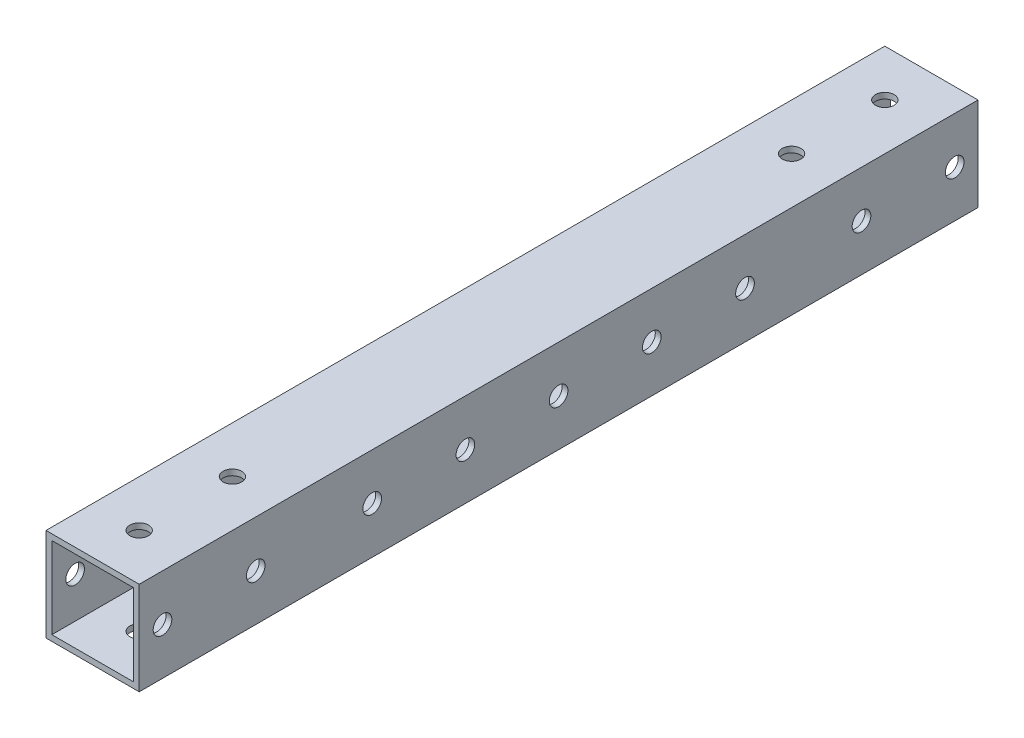
ISO-10303-21;
HEADER;
FILE_DESCRIPTION(('STEP AP214'),'2;1');
FILE_NAME('part.step','',(''),(''),'','','');
FILE_SCHEMA(('AUTOMOTIVE_DESIGN { 1 0 10303 214 1 1 1 1 }'));
ENDSEC;
DATA;
#1=APPLICATION_CONTEXT('core data for automotive mechanical design processes');
#2=APPLICATION_PROTOCOL_DEFINITION('international standard','automotive_design',2000,#1);
#3=PRODUCT_CONTEXT('',#1,'mechanical');
#4=PRODUCT('Part','Part','',(#3));
#5=PRODUCT_RELATED_PRODUCT_CATEGORY('part','',(#4));
#6=PRODUCT_DEFINITION_FORMATION('','',#4);
#7=PRODUCT_DEFINITION_CONTEXT('part definition',#1,'design');
#8=PRODUCT_DEFINITION('design','',#6,#7);
#9=PRODUCT_DEFINITION_SHAPE('','',#8);
#10=(LENGTH_UNIT() NAMED_UNIT(*) SI_UNIT(.MILLI.,.METRE.));
#11=(NAMED_UNIT(*) PLANE_ANGLE_UNIT() SI_UNIT($,.RADIAN.));
#12=(NAMED_UNIT(*) SI_UNIT($,.STERADIAN.) SOLID_ANGLE_UNIT());
#13=UNCERTAINTY_MEASURE_WITH_UNIT(LENGTH_MEASURE(1.E-05),#10,'distance_accuracy_value','');
#14=(GEOMETRIC_REPRESENTATION_CONTEXT(3) GLOBAL_UNCERTAINTY_ASSIGNED_CONTEXT((#13)) GLOBAL_UNIT_ASSIGNED_CONTEXT((#10,
#11,#12)) REPRESENTATION_CONTEXT('',''));
#15=CARTESIAN_POINT('',(0.,0.,0.));
#16=DIRECTION('',(0.,0.,1.));
#17=DIRECTION('',(1.,0.,0.));
#18=AXIS2_PLACEMENT_3D('',#15,#16,#17);
#19=CARTESIAN_POINT('',(0.,0.,228.6));
#20=DIRECTION('',(0.,0.,-1.));
#21=DIRECTION('',(-1.,0.,0.));
#22=AXIS2_PLACEMENT_3D('',#19,#20,#21);
#23=PLANE('',#22);
#24=DIRECTION('',(0.,-1.,0.));
#25=VECTOR('',#24,1.);
#26=CARTESIAN_POINT('',(0.,0.,228.6));
#27=LINE('',#26,#25);
#28=CARTESIAN_POINT('',(0.,25.4,228.6));
#29=VERTEX_POINT('',#28);
#30=CARTESIAN_POINT('',(0.,0.,228.6));
#31=VERTEX_POINT('',#30);
#32=EDGE_CURVE('E157',#29,#31,#27,.T.);
#33=ORIENTED_EDGE('',*,*,#32,.T.);
#34=DIRECTION('',(1.,0.,0.));
#35=VECTOR('',#34,1.);
#36=CARTESIAN_POINT('',(0.,0.,228.6));
#37=LINE('',#36,#35);
#38=CARTESIAN_POINT('',(25.4,0.,228.6));
#39=VERTEX_POINT('',#38);
#40=EDGE_CURVE('E161',#31,#39,#37,.T.);
#41=ORIENTED_EDGE('',*,*,#40,.T.);
#42=DIRECTION('',(0.,1.,0.));
#43=VECTOR('',#42,1.);
#44=CARTESIAN_POINT('',(25.4,0.,228.6));
#45=LINE('',#44,#43);
#46=CARTESIAN_POINT('',(25.4,25.4,228.6));
#47=VERTEX_POINT('',#46);
#48=EDGE_CURVE('E165',#39,#47,#45,.T.);
#49=ORIENTED_EDGE('',*,*,#48,.T.);
#50=DIRECTION('',(-1.,0.,0.));
#51=VECTOR('',#50,1.);
#52=CARTESIAN_POINT('',(0.,25.4,228.6));
#53=LINE('',#52,#51);
#54=EDGE_CURVE('E168',#47,#29,#53,.T.);
#55=ORIENTED_EDGE('',*,*,#54,.T.);
#56=EDGE_LOOP('',(#33,#41,#49,#55));
#57=FACE_BOUND('',#56,.T.);
#58=DIRECTION('',(0.,-1.,0.));
#59=VECTOR('',#58,1.);
#60=CARTESIAN_POINT('',(1.5875,1.5875,228.6));
#61=LINE('',#60,#59);
#62=CARTESIAN_POINT('',(1.5875,23.8125,228.6));
#63=VERTEX_POINT('',#62);
#64=CARTESIAN_POINT('',(1.5875,1.5875,228.6));
#65=VERTEX_POINT('',#64);
#66=EDGE_CURVE('E107',#63,#65,#61,.T.);
#67=ORIENTED_EDGE('',*,*,#66,.F.);
#68=DIRECTION('',(-1.,0.,0.));
#69=VECTOR('',#68,1.);
#70=CARTESIAN_POINT('',(1.5875,23.8125,228.6));
#71=LINE('',#70,#69);
#72=CARTESIAN_POINT('',(23.8125,23.8125,228.6));
#73=VERTEX_POINT('',#72);
#74=EDGE_CURVE('E133',#73,#63,#71,.T.);
#75=ORIENTED_EDGE('',*,*,#74,.F.);
#76=DIRECTION('',(0.,1.,0.));
#77=VECTOR('',#76,1.);
#78=CARTESIAN_POINT('',(23.8125,1.5875,228.6));
#79=LINE('',#78,#77);
#80=CARTESIAN_POINT('',(23.8125,1.5875,228.6));
#81=VERTEX_POINT('',#80);
#82=EDGE_CURVE('E129',#81,#73,#79,.T.);
#83=ORIENTED_EDGE('',*,*,#82,.F.);
#84=DIRECTION('',(1.,0.,0.));
#85=VECTOR('',#84,1.);
#86=CARTESIAN_POINT('',(1.5875,1.5875,228.6));
#87=LINE('',#86,#85);
#88=EDGE_CURVE('E116',#65,#81,#87,.T.);
#89=ORIENTED_EDGE('',*,*,#88,.F.);
#90=EDGE_LOOP('',(#67,#75,#83,#89));
#91=FACE_BOUND('',#90,.T.);
#92=ADVANCED_FACE('F39',(#57,#91),#23,.F.);
#93=CARTESIAN_POINT('',(0.,0.,0.));
#94=DIRECTION('',(0.,0.,-1.));
#95=DIRECTION('',(-1.,0.,0.));
#96=AXIS2_PLACEMENT_3D('',#93,#94,#95);
#97=PLANE('',#96);
#98=DIRECTION('',(0.,-1.,0.));
#99=VECTOR('',#98,1.);
#100=CARTESIAN_POINT('',(0.,0.,0.));
#101=LINE('',#100,#99);
#102=CARTESIAN_POINT('',(0.,25.4,0.));
#103=VERTEX_POINT('',#102);
#104=CARTESIAN_POINT('',(0.,0.,0.));
#105=VERTEX_POINT('',#104);
#106=EDGE_CURVE('E125',#103,#105,#101,.T.);
#107=ORIENTED_EDGE('',*,*,#106,.F.);
#108=DIRECTION('',(-1.,0.,0.));
#109=VECTOR('',#108,1.);
#110=CARTESIAN_POINT('',(0.,25.4,0.));
#111=LINE('',#110,#109);
#112=CARTESIAN_POINT('',(25.4,25.4,0.));
#113=VERTEX_POINT('',#112);
#114=EDGE_CURVE('E162',#113,#103,#111,.T.);
#115=ORIENTED_EDGE('',*,*,#114,.F.);
#116=DIRECTION('',(0.,1.,0.));
#117=VECTOR('',#116,1.);
#118=CARTESIAN_POINT('',(25.4,0.,0.));
#119=LINE('',#118,#117);
#120=CARTESIAN_POINT('',(25.4,0.,0.));
#121=VERTEX_POINT('',#120);
#122=EDGE_CURVE('E178',#121,#113,#119,.T.);
#123=ORIENTED_EDGE('',*,*,#122,.F.);
#124=DIRECTION('',(1.,0.,0.));
#125=VECTOR('',#124,1.);
#126=CARTESIAN_POINT('',(0.,0.,0.));
#127=LINE('',#126,#125);
#128=EDGE_CURVE('E175',#105,#121,#127,.T.);
#129=ORIENTED_EDGE('',*,*,#128,.F.);
#130=EDGE_LOOP('',(#107,#115,#123,#129));
#131=FACE_BOUND('',#130,.T.);
#132=DIRECTION('',(-1.,0.,0.));
#133=VECTOR('',#132,1.);
#134=CARTESIAN_POINT('',(1.5875,23.8125,0.));
#135=LINE('',#134,#133);
#136=CARTESIAN_POINT('',(23.8125,23.8125,0.));
#137=VERTEX_POINT('',#136);
#138=CARTESIAN_POINT('',(1.5875,23.8125,0.));
#139=VERTEX_POINT('',#138);
#140=EDGE_CURVE('E117',#137,#139,#135,.T.);
#141=ORIENTED_EDGE('',*,*,#140,.T.);
#142=DIRECTION('',(0.,-1.,0.));
#143=VECTOR('',#142,1.);
#144=CARTESIAN_POINT('',(1.5875,1.5875,0.));
#145=LINE('',#144,#143);
#146=CARTESIAN_POINT('',(1.5875,1.5875,0.));
#147=VERTEX_POINT('',#146);
#148=EDGE_CURVE('E65',#139,#147,#145,.T.);
#149=ORIENTED_EDGE('',*,*,#148,.T.);
#150=DIRECTION('',(1.,0.,0.));
#151=VECTOR('',#150,1.);
#152=CARTESIAN_POINT('',(1.5875,1.5875,0.));
#153=LINE('',#152,#151);
#154=CARTESIAN_POINT('',(23.8125,1.5875,0.));
#155=VERTEX_POINT('',#154);
#156=EDGE_CURVE('E123',#147,#155,#153,.T.);
#157=ORIENTED_EDGE('',*,*,#156,.T.);
#158=DIRECTION('',(0.,1.,0.));
#159=VECTOR('',#158,1.);
#160=CARTESIAN_POINT('',(23.8125,1.5875,0.));
#161=LINE('',#160,#159);
#162=EDGE_CURVE('E144',#155,#137,#161,.T.);
#163=ORIENTED_EDGE('',*,*,#162,.T.);
#164=EDGE_LOOP('',(#141,#149,#157,#163));
#165=FACE_BOUND('',#164,.T.);
#166=ADVANCED_FACE('F348',(#131,#165),#97,.T.);
#167=CARTESIAN_POINT('',(0.,0.,228.6));
#168=DIRECTION('',(1.,0.,0.));
#169=DIRECTION('',(0.,0.,-1.));
#170=AXIS2_PLACEMENT_3D('',#167,#168,#169);
#171=PLANE('',#170);
#172=CARTESIAN_POINT('',(0.,12.7,222.25));
#173=DIRECTION('',(1.,0.,0.));
#174=DIRECTION('',(0.,0.,-1.));
#175=AXIS2_PLACEMENT_3D('',#172,#173,#174);
#176=CIRCLE('',#175,2.53999999999998);
#177=CARTESIAN_POINT('',(0.,12.7,219.71));
#178=VERTEX_POINT('',#177);
#179=EDGE_CURVE('E218',#178,#178,#176,.T.);
#180=ORIENTED_EDGE('',*,*,#179,.T.);
#181=EDGE_LOOP('',(#180));
#182=FACE_BOUND('',#181,.T.);
#183=CARTESIAN_POINT('',(0.,12.6999999999996,165.1));
#184=DIRECTION('',(1.,0.,0.));
#185=DIRECTION('',(0.,0.,-1.));
#186=AXIS2_PLACEMENT_3D('',#183,#184,#185);
#187=CIRCLE('',#186,2.53999999999998);
#188=CARTESIAN_POINT('',(0.,12.6999999999996,162.56));
#189=VERTEX_POINT('',#188);
#190=EDGE_CURVE('E483',#189,#189,#187,.T.);
#191=ORIENTED_EDGE('',*,*,#190,.T.);
#192=EDGE_LOOP('',(#191));
#193=FACE_BOUND('',#192,.T.);
#194=CARTESIAN_POINT('',(0.,12.6999999999998,139.7));
#195=DIRECTION('',(1.,0.,0.));
#196=DIRECTION('',(0.,0.,-1.));
#197=AXIS2_PLACEMENT_3D('',#194,#195,#196);
#198=CIRCLE('',#197,2.53999999999998);
#199=CARTESIAN_POINT('',(0.,12.6999999999998,137.16));
#200=VERTEX_POINT('',#199);
#201=EDGE_CURVE('E487',#200,#200,#198,.T.);
#202=ORIENTED_EDGE('',*,*,#201,.T.);
#203=EDGE_LOOP('',(#202));
#204=FACE_BOUND('',#203,.T.);
#205=CARTESIAN_POINT('',(0.,12.7,6.34999999999999));
#206=DIRECTION('',(1.,0.,0.));
#207=DIRECTION('',(0.,0.,1.));
#208=AXIS2_PLACEMENT_3D('',#205,#206,#207);
#209=CIRCLE('',#208,2.53999999999998);
#210=CARTESIAN_POINT('',(0.,12.7,8.88999999999998));
#211=VERTEX_POINT('',#210);
#212=EDGE_CURVE('E491',#211,#211,#209,.T.);
#213=ORIENTED_EDGE('',*,*,#212,.T.);
#214=EDGE_LOOP('',(#213));
#215=FACE_BOUND('',#214,.T.);
#216=CARTESIAN_POINT('',(0.,12.7,31.75));
#217=DIRECTION('',(1.,0.,0.));
#218=DIRECTION('',(0.,0.,1.));
#219=AXIS2_PLACEMENT_3D('',#216,#217,#218);
#220=CIRCLE('',#219,2.53999999999998);
#221=CARTESIAN_POINT('',(0.,12.7,34.29));
#222=VERTEX_POINT('',#221);
#223=EDGE_CURVE('E434',#222,#222,#220,.T.);
#224=ORIENTED_EDGE('',*,*,#223,.T.);
#225=EDGE_LOOP('',(#224));
#226=FACE_BOUND('',#225,.T.);
#227=CARTESIAN_POINT('',(0.,12.7,63.5));
#228=DIRECTION('',(1.,0.,0.));
#229=DIRECTION('',(0.,0.,-1.));
#230=AXIS2_PLACEMENT_3D('',#227,#228,#229);
#231=CIRCLE('',#230,2.54);
#232=CARTESIAN_POINT('',(0.,12.7,60.96));
#233=VERTEX_POINT('',#232);
#234=EDGE_CURVE('E428',#233,#233,#231,.T.);
#235=ORIENTED_EDGE('',*,*,#234,.T.);
#236=EDGE_LOOP('',(#235));
#237=FACE_BOUND('',#236,.T.);
#238=CARTESIAN_POINT('',(0.,12.7,88.9));
#239=DIRECTION('',(1.,0.,0.));
#240=DIRECTION('',(0.,0.,-1.));
#241=AXIS2_PLACEMENT_3D('',#238,#239,#240);
#242=CIRCLE('',#241,2.54000000000001);
#243=CARTESIAN_POINT('',(0.,12.7,86.36));
#244=VERTEX_POINT('',#243);
#245=EDGE_CURVE('E422',#244,#244,#242,.T.);
#246=ORIENTED_EDGE('',*,*,#245,.T.);
#247=EDGE_LOOP('',(#246));
#248=FACE_BOUND('',#247,.T.);
#249=CARTESIAN_POINT('',(0.,12.7,114.3));
#250=DIRECTION('',(1.,0.,0.));
#251=DIRECTION('',(0.,0.,-1.));
#252=AXIS2_PLACEMENT_3D('',#249,#250,#251);
#253=CIRCLE('',#252,2.54);
#254=CARTESIAN_POINT('',(0.,12.7,111.76));
#255=VERTEX_POINT('',#254);
#256=EDGE_CURVE('E410',#255,#255,#253,.T.);
#257=ORIENTED_EDGE('',*,*,#256,.T.);
#258=EDGE_LOOP('',(#257));
#259=FACE_BOUND('',#258,.T.);
#260=CARTESIAN_POINT('',(0.,12.7,196.85));
#261=DIRECTION('',(1.,0.,0.));
#262=DIRECTION('',(0.,0.,-1.));
#263=AXIS2_PLACEMENT_3D('',#260,#261,#262);
#264=CIRCLE('',#263,2.53999999999998);
#265=CARTESIAN_POINT('',(0.,12.7,194.31));
#266=VERTEX_POINT('',#265);
#267=EDGE_CURVE('E409',#266,#266,#264,.T.);
#268=ORIENTED_EDGE('',*,*,#267,.T.);
#269=EDGE_LOOP('',(#268));
#270=FACE_BOUND('',#269,.T.);
#271=ORIENTED_EDGE('',*,*,#106,.T.);
#272=DIRECTION('',(0.,0.,-1.));
#273=VECTOR('',#272,1.);
#274=CARTESIAN_POINT('',(0.,0.,228.6));
#275=LINE('',#274,#273);
#276=EDGE_CURVE('E11',#31,#105,#275,.T.);
#277=ORIENTED_EDGE('',*,*,#276,.F.);
#278=ORIENTED_EDGE('',*,*,#32,.F.);
#279=DIRECTION('',(0.,0.,-1.));
#280=VECTOR('',#279,1.);
#281=CARTESIAN_POINT('',(0.,25.4,228.6));
#282=LINE('',#281,#280);
#283=EDGE_CURVE('E171',#29,#103,#282,.T.);
#284=ORIENTED_EDGE('',*,*,#283,.T.);
#285=EDGE_LOOP('',(#271,#277,#278,#284));
#286=FACE_BOUND('',#285,.T.);
#287=ADVANCED_FACE('F41',(#182,#193,#204,#215,#226,#237,#248,#259,#270,#286),#171,.F.);
#288=CARTESIAN_POINT('',(0.,0.,228.6));
#289=DIRECTION('',(0.,1.,0.));
#290=DIRECTION('',(0.,0.,1.));
#291=AXIS2_PLACEMENT_3D('',#288,#289,#290);
#292=PLANE('',#291);
#293=CARTESIAN_POINT('',(12.7,0.,215.9));
#294=DIRECTION('',(0.,1.,0.));
#295=DIRECTION('',(0.,0.,1.));
#296=AXIS2_PLACEMENT_3D('',#293,#294,#295);
#297=CIRCLE('',#296,2.53999999999993);
#298=CARTESIAN_POINT('',(12.7,0.,218.44));
#299=VERTEX_POINT('',#298);
#300=EDGE_CURVE('E198',#299,#299,#297,.T.);
#301=ORIENTED_EDGE('',*,*,#300,.T.);
#302=EDGE_LOOP('',(#301));
#303=FACE_BOUND('',#302,.T.);
#304=CARTESIAN_POINT('',(12.7,0.,38.1));
#305=DIRECTION('',(0.,1.,0.));
#306=DIRECTION('',(0.,0.,-1.));
#307=AXIS2_PLACEMENT_3D('',#304,#305,#306);
#308=CIRCLE('',#307,2.53999999999993);
#309=CARTESIAN_POINT('',(12.7,0.,35.56));
#310=VERTEX_POINT('',#309);
#311=EDGE_CURVE('E278',#310,#310,#308,.T.);
#312=ORIENTED_EDGE('',*,*,#311,.T.);
#313=EDGE_LOOP('',(#312));
#314=FACE_BOUND('',#313,.T.);
#315=CARTESIAN_POINT('',(12.7,0.,12.7));
#316=DIRECTION('',(0.,1.,0.));
#317=DIRECTION('',(0.,0.,-1.));
#318=AXIS2_PLACEMENT_3D('',#315,#316,#317);
#319=CIRCLE('',#318,2.53999999999992);
#320=CARTESIAN_POINT('',(12.7,0.,10.1600000000001));
#321=VERTEX_POINT('',#320);
#322=EDGE_CURVE('E293',#321,#321,#319,.T.);
#323=ORIENTED_EDGE('',*,*,#322,.T.);
#324=EDGE_LOOP('',(#323));
#325=FACE_BOUND('',#324,.T.);
#326=CARTESIAN_POINT('',(12.7,0.,190.5));
#327=DIRECTION('',(0.,1.,0.));
#328=DIRECTION('',(0.,0.,1.));
#329=AXIS2_PLACEMENT_3D('',#326,#327,#328);
#330=CIRCLE('',#329,2.53999999999993);
#331=CARTESIAN_POINT('',(12.7,0.,193.04));
#332=VERTEX_POINT('',#331);
#333=EDGE_CURVE('E277',#332,#332,#330,.T.);
#334=ORIENTED_EDGE('',*,*,#333,.T.);
#335=EDGE_LOOP('',(#334));
#336=FACE_BOUND('',#335,.T.);
#337=ORIENTED_EDGE('',*,*,#128,.T.);
#338=DIRECTION('',(0.,0.,-1.));
#339=VECTOR('',#338,1.);
#340=CARTESIAN_POINT('',(25.4,0.,228.6));
#341=LINE('',#340,#339);
#342=EDGE_CURVE('E49',#39,#121,#341,.T.);
#343=ORIENTED_EDGE('',*,*,#342,.F.);
#344=ORIENTED_EDGE('',*,*,#40,.F.);
#345=ORIENTED_EDGE('',*,*,#276,.T.);
#346=EDGE_LOOP('',(#337,#343,#344,#345));
#347=FACE_BOUND('',#346,.T.);
#348=ADVANCED_FACE('F334',(#303,#314,#325,#336,#347),#292,.F.);
#349=CARTESIAN_POINT('',(25.4,0.,228.6));
#350=DIRECTION('',(-1.,0.,0.));
#351=DIRECTION('',(0.,0.,1.));
#352=AXIS2_PLACEMENT_3D('',#349,#350,#351);
#353=PLANE('',#352);
#354=CARTESIAN_POINT('',(25.4,12.7,222.25));
#355=DIRECTION('',(1.,0.,0.));
#356=DIRECTION('',(0.,0.,-1.));
#357=AXIS2_PLACEMENT_3D('',#354,#355,#356);
#358=CIRCLE('',#357,2.53999999999998);
#359=CARTESIAN_POINT('',(25.4,12.7,219.71));
#360=VERTEX_POINT('',#359);
#361=EDGE_CURVE('E375',#360,#360,#358,.T.);
#362=ORIENTED_EDGE('',*,*,#361,.F.);
#363=EDGE_LOOP('',(#362));
#364=FACE_BOUND('',#363,.T.);
#365=CARTESIAN_POINT('',(25.4,12.6999999999996,165.1));
#366=DIRECTION('',(1.,0.,0.));
#367=DIRECTION('',(0.,0.,-1.));
#368=AXIS2_PLACEMENT_3D('',#365,#366,#367);
#369=CIRCLE('',#368,2.53999999999998);
#370=CARTESIAN_POINT('',(25.4,12.6999999999996,162.56));
#371=VERTEX_POINT('',#370);
#372=EDGE_CURVE('E379',#371,#371,#369,.T.);
#373=ORIENTED_EDGE('',*,*,#372,.F.);
#374=EDGE_LOOP('',(#373));
#375=FACE_BOUND('',#374,.T.);
#376=CARTESIAN_POINT('',(25.4,12.6999999999998,139.7));
#377=DIRECTION('',(1.,0.,0.));
#378=DIRECTION('',(0.,0.,-1.));
#379=AXIS2_PLACEMENT_3D('',#376,#377,#378);
#380=CIRCLE('',#379,2.53999999999998);
#381=CARTESIAN_POINT('',(25.4,12.6999999999998,137.16));
#382=VERTEX_POINT('',#381);
#383=EDGE_CURVE('E383',#382,#382,#380,.T.);
#384=ORIENTED_EDGE('',*,*,#383,.F.);
#385=EDGE_LOOP('',(#384));
#386=FACE_BOUND('',#385,.T.);
#387=CARTESIAN_POINT('',(25.4,12.7,6.34999999999999));
#388=DIRECTION('',(1.,0.,0.));
#389=DIRECTION('',(0.,0.,1.));
#390=AXIS2_PLACEMENT_3D('',#387,#388,#389);
#391=CIRCLE('',#390,2.53999999999998);
#392=CARTESIAN_POINT('',(25.4,12.7,8.88999999999998));
#393=VERTEX_POINT('',#392);
#394=EDGE_CURVE('E387',#393,#393,#391,.T.);
#395=ORIENTED_EDGE('',*,*,#394,.F.);
#396=EDGE_LOOP('',(#395));
#397=FACE_BOUND('',#396,.T.);
#398=CARTESIAN_POINT('',(25.4,12.7,31.75));
#399=DIRECTION('',(1.,0.,0.));
#400=DIRECTION('',(0.,0.,1.));
#401=AXIS2_PLACEMENT_3D('',#398,#399,#400);
#402=CIRCLE('',#401,2.53999999999998);
#403=CARTESIAN_POINT('',(25.4,12.7,34.29));
#404=VERTEX_POINT('',#403);
#405=EDGE_CURVE('E391',#404,#404,#402,.T.);
#406=ORIENTED_EDGE('',*,*,#405,.F.);
#407=EDGE_LOOP('',(#406));
#408=FACE_BOUND('',#407,.T.);
#409=CARTESIAN_POINT('',(25.4,12.7,63.5));
#410=DIRECTION('',(1.,0.,0.));
#411=DIRECTION('',(0.,0.,-1.));
#412=AXIS2_PLACEMENT_3D('',#409,#410,#411);
#413=CIRCLE('',#412,2.54);
#414=CARTESIAN_POINT('',(25.4,12.7,60.96));
#415=VERTEX_POINT('',#414);
#416=EDGE_CURVE('E395',#415,#415,#413,.T.);
#417=ORIENTED_EDGE('',*,*,#416,.F.);
#418=EDGE_LOOP('',(#417));
#419=FACE_BOUND('',#418,.T.);
#420=CARTESIAN_POINT('',(25.4,12.7,88.9));
#421=DIRECTION('',(1.,0.,0.));
#422=DIRECTION('',(0.,0.,-1.));
#423=AXIS2_PLACEMENT_3D('',#420,#421,#422);
#424=CIRCLE('',#423,2.54000000000001);
#425=CARTESIAN_POINT('',(25.4,12.7,86.36));
#426=VERTEX_POINT('',#425);
#427=EDGE_CURVE('E399',#426,#426,#424,.T.);
#428=ORIENTED_EDGE('',*,*,#427,.F.);
#429=EDGE_LOOP('',(#428));
#430=FACE_BOUND('',#429,.T.);
#431=CARTESIAN_POINT('',(25.4,12.7,114.3));
#432=DIRECTION('',(1.,0.,0.));
#433=DIRECTION('',(0.,0.,-1.));
#434=AXIS2_PLACEMENT_3D('',#431,#432,#433);
#435=CIRCLE('',#434,2.54);
#436=CARTESIAN_POINT('',(25.4,12.7,111.76));
#437=VERTEX_POINT('',#436);
#438=EDGE_CURVE('E403',#437,#437,#435,.T.);
#439=ORIENTED_EDGE('',*,*,#438,.F.);
#440=EDGE_LOOP('',(#439));
#441=FACE_BOUND('',#440,.T.);
#442=CARTESIAN_POINT('',(25.4,12.7,196.85));
#443=DIRECTION('',(1.,0.,0.));
#444=DIRECTION('',(0.,0.,-1.));
#445=AXIS2_PLACEMENT_3D('',#442,#443,#444);
#446=CIRCLE('',#445,2.53999999999998);
#447=CARTESIAN_POINT('',(25.4,12.7,194.31));
#448=VERTEX_POINT('',#447);
#449=EDGE_CURVE('E406',#448,#448,#446,.T.);
#450=ORIENTED_EDGE('',*,*,#449,.F.);
#451=EDGE_LOOP('',(#450));
#452=FACE_BOUND('',#451,.T.);
#453=ORIENTED_EDGE('',*,*,#122,.T.);
#454=DIRECTION('',(0.,0.,-1.));
#455=VECTOR('',#454,1.);
#456=CARTESIAN_POINT('',(25.4,25.4,228.6));
#457=LINE('',#456,#455);
#458=EDGE_CURVE('E186',#47,#113,#457,.T.);
#459=ORIENTED_EDGE('',*,*,#458,.F.);
#460=ORIENTED_EDGE('',*,*,#48,.F.);
#461=ORIENTED_EDGE('',*,*,#342,.T.);
#462=EDGE_LOOP('',(#453,#459,#460,#461));
#463=FACE_BOUND('',#462,.T.);
#464=ADVANCED_FACE('F337',(#364,#375,#386,#397,#408,#419,#430,#441,#452,#463),#353,.F.);
#465=CARTESIAN_POINT('',(0.,25.4,228.6));
#466=DIRECTION('',(0.,-1.,0.));
#467=DIRECTION('',(0.,0.,-1.));
#468=AXIS2_PLACEMENT_3D('',#465,#466,#467);
#469=PLANE('',#468);
#470=CARTESIAN_POINT('',(12.7,25.4,215.9));
#471=DIRECTION('',(0.,1.,0.));
#472=DIRECTION('',(0.,0.,1.));
#473=AXIS2_PLACEMENT_3D('',#470,#471,#472);
#474=CIRCLE('',#473,2.53999999999993);
#475=CARTESIAN_POINT('',(12.7,25.4,218.44));
#476=VERTEX_POINT('',#475);
#477=EDGE_CURVE('E273',#476,#476,#474,.T.);
#478=ORIENTED_EDGE('',*,*,#477,.F.);
#479=EDGE_LOOP('',(#478));
#480=FACE_BOUND('',#479,.T.);
#481=CARTESIAN_POINT('',(12.7,25.4,38.1));
#482=DIRECTION('',(0.,1.,0.));
#483=DIRECTION('',(0.,0.,-1.));
#484=AXIS2_PLACEMENT_3D('',#481,#482,#483);
#485=CIRCLE('',#484,2.53999999999993);
#486=CARTESIAN_POINT('',(12.7,25.4,35.56));
#487=VERTEX_POINT('',#486);
#488=EDGE_CURVE('E269',#487,#487,#485,.T.);
#489=ORIENTED_EDGE('',*,*,#488,.F.);
#490=EDGE_LOOP('',(#489));
#491=FACE_BOUND('',#490,.T.);
#492=CARTESIAN_POINT('',(12.7,25.4,12.7));
#493=DIRECTION('',(0.,1.,0.));
#494=DIRECTION('',(0.,0.,-1.));
#495=AXIS2_PLACEMENT_3D('',#492,#493,#494);
#496=CIRCLE('',#495,2.53999999999992);
#497=CARTESIAN_POINT('',(12.7,25.4,10.1600000000001));
#498=VERTEX_POINT('',#497);
#499=EDGE_CURVE('E282',#498,#498,#496,.T.);
#500=ORIENTED_EDGE('',*,*,#499,.F.);
#501=EDGE_LOOP('',(#500));
#502=FACE_BOUND('',#501,.T.);
#503=CARTESIAN_POINT('',(12.7,25.4,190.5));
#504=DIRECTION('',(0.,1.,0.));
#505=DIRECTION('',(0.,0.,1.));
#506=AXIS2_PLACEMENT_3D('',#503,#504,#505);
#507=CIRCLE('',#506,2.53999999999993);
#508=CARTESIAN_POINT('',(12.7,25.4,193.04));
#509=VERTEX_POINT('',#508);
#510=EDGE_CURVE('E289',#509,#509,#507,.T.);
#511=ORIENTED_EDGE('',*,*,#510,.F.);
#512=EDGE_LOOP('',(#511));
#513=FACE_BOUND('',#512,.T.);
#514=ORIENTED_EDGE('',*,*,#114,.T.);
#515=ORIENTED_EDGE('',*,*,#283,.F.);
#516=ORIENTED_EDGE('',*,*,#54,.F.);
#517=ORIENTED_EDGE('',*,*,#458,.T.);
#518=EDGE_LOOP('',(#514,#515,#516,#517));
#519=FACE_BOUND('',#518,.T.);
#520=ADVANCED_FACE('F352',(#480,#491,#502,#513,#519),#469,.F.);
#521=CARTESIAN_POINT('',(1.5875,1.5875,228.6));
#522=DIRECTION('',(1.,0.,0.));
#523=DIRECTION('',(0.,0.,-1.));
#524=AXIS2_PLACEMENT_3D('',#521,#522,#523);
#525=PLANE('',#524);
#526=CARTESIAN_POINT('',(1.5875,12.7,222.25));
#527=DIRECTION('',(1.,0.,0.));
#528=DIRECTION('',(0.,0.,-1.));
#529=AXIS2_PLACEMENT_3D('',#526,#527,#528);
#530=CIRCLE('',#529,2.53999999999998);
#531=CARTESIAN_POINT('',(1.5875,12.7,219.71));
#532=VERTEX_POINT('',#531);
#533=EDGE_CURVE('E265',#532,#532,#530,.T.);
#534=ORIENTED_EDGE('',*,*,#533,.F.);
#535=EDGE_LOOP('',(#534));
#536=FACE_BOUND('',#535,.T.);
#537=CARTESIAN_POINT('',(1.5875,12.6999999999996,165.1));
#538=DIRECTION('',(1.,0.,0.));
#539=DIRECTION('',(0.,0.,-1.));
#540=AXIS2_PLACEMENT_3D('',#537,#538,#539);
#541=CIRCLE('',#540,2.53999999999998);
#542=CARTESIAN_POINT('',(1.5875,12.6999999999996,162.56));
#543=VERTEX_POINT('',#542);
#544=EDGE_CURVE('E251',#543,#543,#541,.T.);
#545=ORIENTED_EDGE('',*,*,#544,.F.);
#546=EDGE_LOOP('',(#545));
#547=FACE_BOUND('',#546,.T.);
#548=CARTESIAN_POINT('',(1.5875,12.6999999999998,139.7));
#549=DIRECTION('',(1.,0.,0.));
#550=DIRECTION('',(0.,0.,-1.));
#551=AXIS2_PLACEMENT_3D('',#548,#549,#550);
#552=CIRCLE('',#551,2.53999999999998);
#553=CARTESIAN_POINT('',(1.5875,12.6999999999998,137.16));
#554=VERTEX_POINT('',#553);
#555=EDGE_CURVE('E247',#554,#554,#552,.T.);
#556=ORIENTED_EDGE('',*,*,#555,.F.);
#557=EDGE_LOOP('',(#556));
#558=FACE_BOUND('',#557,.T.);
#559=CARTESIAN_POINT('',(1.5875,12.7,6.34999999999999));
#560=DIRECTION('',(1.,0.,0.));
#561=DIRECTION('',(0.,0.,-1.));
#562=AXIS2_PLACEMENT_3D('',#559,#560,#561);
#563=CIRCLE('',#562,2.53999999999998);
#564=CARTESIAN_POINT('',(1.5875,12.7,3.81000000000001));
#565=VERTEX_POINT('',#564);
#566=EDGE_CURVE('E243',#565,#565,#563,.T.);
#567=ORIENTED_EDGE('',*,*,#566,.F.);
#568=EDGE_LOOP('',(#567));
#569=FACE_BOUND('',#568,.T.);
#570=CARTESIAN_POINT('',(1.5875,12.7,31.75));
#571=DIRECTION('',(1.,0.,0.));
#572=DIRECTION('',(0.,0.,-1.));
#573=AXIS2_PLACEMENT_3D('',#570,#571,#572);
#574=CIRCLE('',#573,2.53999999999998);
#575=CARTESIAN_POINT('',(1.5875,12.7,29.21));
#576=VERTEX_POINT('',#575);
#577=EDGE_CURVE('E238',#576,#576,#574,.T.);
#578=ORIENTED_EDGE('',*,*,#577,.F.);
#579=EDGE_LOOP('',(#578));
#580=FACE_BOUND('',#579,.T.);
#581=CARTESIAN_POINT('',(1.5875,12.7,63.5));
#582=DIRECTION('',(1.,0.,0.));
#583=DIRECTION('',(0.,0.,-1.));
#584=AXIS2_PLACEMENT_3D('',#581,#582,#583);
#585=CIRCLE('',#584,2.54);
#586=CARTESIAN_POINT('',(1.5875,12.7,60.96));
#587=VERTEX_POINT('',#586);
#588=EDGE_CURVE('E233',#587,#587,#585,.T.);
#589=ORIENTED_EDGE('',*,*,#588,.F.);
#590=EDGE_LOOP('',(#589));
#591=FACE_BOUND('',#590,.T.);
#592=CARTESIAN_POINT('',(1.5875,12.7,88.9));
#593=DIRECTION('',(1.,0.,0.));
#594=DIRECTION('',(0.,0.,-1.));
#595=AXIS2_PLACEMENT_3D('',#592,#593,#594);
#596=CIRCLE('',#595,2.54000000000001);
#597=CARTESIAN_POINT('',(1.5875,12.7,86.36));
#598=VERTEX_POINT('',#597);
#599=EDGE_CURVE('E228',#598,#598,#596,.T.);
#600=ORIENTED_EDGE('',*,*,#599,.F.);
#601=EDGE_LOOP('',(#600));
#602=FACE_BOUND('',#601,.T.);
#603=CARTESIAN_POINT('',(1.5875,12.7,114.3));
#604=DIRECTION('',(1.,0.,0.));
#605=DIRECTION('',(0.,0.,-1.));
#606=AXIS2_PLACEMENT_3D('',#603,#604,#605);
#607=CIRCLE('',#606,2.54);
#608=CARTESIAN_POINT('',(1.5875,12.7,111.76));
#609=VERTEX_POINT('',#608);
#610=EDGE_CURVE('E223',#609,#609,#607,.T.);
#611=ORIENTED_EDGE('',*,*,#610,.F.);
#612=EDGE_LOOP('',(#611));
#613=FACE_BOUND('',#612,.T.);
#614=CARTESIAN_POINT('',(1.5875,12.7,196.85));
#615=DIRECTION('',(1.,0.,0.));
#616=DIRECTION('',(0.,0.,-1.));
#617=AXIS2_PLACEMENT_3D('',#614,#615,#616);
#618=CIRCLE('',#617,2.53999999999998);
#619=CARTESIAN_POINT('',(1.5875,12.7,194.31));
#620=VERTEX_POINT('',#619);
#621=EDGE_CURVE('E217',#620,#620,#618,.T.);
#622=ORIENTED_EDGE('',*,*,#621,.F.);
#623=EDGE_LOOP('',(#622));
#624=FACE_BOUND('',#623,.T.);
#625=ORIENTED_EDGE('',*,*,#148,.F.);
#626=DIRECTION('',(0.,0.,-1.));
#627=VECTOR('',#626,1.);
#628=CARTESIAN_POINT('',(1.5875,23.8125,228.6));
#629=LINE('',#628,#627);
#630=EDGE_CURVE('E111',#63,#139,#629,.T.);
#631=ORIENTED_EDGE('',*,*,#630,.F.);
#632=ORIENTED_EDGE('',*,*,#66,.T.);
#633=DIRECTION('',(0.,0.,-1.));
#634=VECTOR('',#633,1.);
#635=CARTESIAN_POINT('',(1.5875,1.5875,228.6));
#636=LINE('',#635,#634);
#637=EDGE_CURVE('E110',#65,#147,#636,.T.);
#638=ORIENTED_EDGE('',*,*,#637,.T.);
#639=EDGE_LOOP('',(#625,#631,#632,#638));
#640=FACE_BOUND('',#639,.T.);
#641=ADVANCED_FACE('F109',(#536,#547,#558,#569,#580,#591,#602,#613,#624,#640),#525,.T.);
#642=CARTESIAN_POINT('',(1.5875,1.5875,228.6));
#643=DIRECTION('',(0.,1.,0.));
#644=DIRECTION('',(0.,0.,1.));
#645=AXIS2_PLACEMENT_3D('',#642,#643,#644);
#646=PLANE('',#645);
#647=CARTESIAN_POINT('',(12.7,1.5875,215.9));
#648=DIRECTION('',(0.,1.,0.));
#649=DIRECTION('',(0.,0.,1.));
#650=AXIS2_PLACEMENT_3D('',#647,#648,#649);
#651=CIRCLE('',#650,2.53999999999993);
#652=CARTESIAN_POINT('',(12.7,1.5875,218.44));
#653=VERTEX_POINT('',#652);
#654=EDGE_CURVE('E141',#653,#653,#651,.T.);
#655=ORIENTED_EDGE('',*,*,#654,.F.);
#656=EDGE_LOOP('',(#655));
#657=FACE_BOUND('',#656,.T.);
#658=CARTESIAN_POINT('',(12.7,1.5875,38.1));
#659=DIRECTION('',(0.,1.,0.));
#660=DIRECTION('',(0.,0.,1.));
#661=AXIS2_PLACEMENT_3D('',#658,#659,#660);
#662=CIRCLE('',#661,2.53999999999993);
#663=CARTESIAN_POINT('',(12.7,1.5875,40.6399999999999));
#664=VERTEX_POINT('',#663);
#665=EDGE_CURVE('E208',#664,#664,#662,.T.);
#666=ORIENTED_EDGE('',*,*,#665,.F.);
#667=EDGE_LOOP('',(#666));
#668=FACE_BOUND('',#667,.T.);
#669=CARTESIAN_POINT('',(12.7,1.5875,12.7));
#670=DIRECTION('',(0.,1.,0.));
#671=DIRECTION('',(0.,0.,1.));
#672=AXIS2_PLACEMENT_3D('',#669,#670,#671);
#673=CIRCLE('',#672,2.53999999999992);
#674=CARTESIAN_POINT('',(12.7,1.5875,15.2399999999999));
#675=VERTEX_POINT('',#674);
#676=EDGE_CURVE('E203',#675,#675,#673,.T.);
#677=ORIENTED_EDGE('',*,*,#676,.F.);
#678=EDGE_LOOP('',(#677));
#679=FACE_BOUND('',#678,.T.);
#680=CARTESIAN_POINT('',(12.7,1.5875,190.5));
#681=DIRECTION('',(0.,1.,0.));
#682=DIRECTION('',(0.,0.,1.));
#683=AXIS2_PLACEMENT_3D('',#680,#681,#682);
#684=CIRCLE('',#683,2.53999999999993);
#685=CARTESIAN_POINT('',(12.7,1.5875,193.04));
#686=VERTEX_POINT('',#685);
#687=EDGE_CURVE('E197',#686,#686,#684,.T.);
#688=ORIENTED_EDGE('',*,*,#687,.F.);
#689=EDGE_LOOP('',(#688));
#690=FACE_BOUND('',#689,.T.);
#691=ORIENTED_EDGE('',*,*,#156,.F.);
#692=ORIENTED_EDGE('',*,*,#637,.F.);
#693=ORIENTED_EDGE('',*,*,#88,.T.);
#694=DIRECTION('',(0.,0.,-1.));
#695=VECTOR('',#694,1.);
#696=CARTESIAN_POINT('',(23.8125,1.5875,228.6));
#697=LINE('',#696,#695);
#698=EDGE_CURVE('E126',#81,#155,#697,.T.);
#699=ORIENTED_EDGE('',*,*,#698,.T.);
#700=EDGE_LOOP('',(#691,#692,#693,#699));
#701=FACE_BOUND('',#700,.T.);
#702=ADVANCED_FACE('F120',(#657,#668,#679,#690,#701),#646,.T.);
#703=CARTESIAN_POINT('',(23.8125,1.5875,228.6));
#704=DIRECTION('',(-1.,0.,0.));
#705=DIRECTION('',(0.,0.,1.));
#706=AXIS2_PLACEMENT_3D('',#703,#704,#705);
#707=PLANE('',#706);
#708=CARTESIAN_POINT('',(23.8125,12.7,222.25));
#709=DIRECTION('',(-1.,0.,0.));
#710=DIRECTION('',(0.,0.,1.));
#711=AXIS2_PLACEMENT_3D('',#708,#709,#710);
#712=CIRCLE('',#711,2.53999999999998);
#713=CARTESIAN_POINT('',(23.8125,12.7,224.79));
#714=VERTEX_POINT('',#713);
#715=EDGE_CURVE('E43',#714,#714,#712,.T.);
#716=ORIENTED_EDGE('',*,*,#715,.F.);
#717=EDGE_LOOP('',(#716));
#718=FACE_BOUND('',#717,.T.);
#719=CARTESIAN_POINT('',(23.8125,12.6999999999996,165.1));
#720=DIRECTION('',(-1.,0.,0.));
#721=DIRECTION('',(0.,0.,1.));
#722=AXIS2_PLACEMENT_3D('',#719,#720,#721);
#723=CIRCLE('',#722,2.53999999999998);
#724=CARTESIAN_POINT('',(23.8125,12.6999999999996,167.64));
#725=VERTEX_POINT('',#724);
#726=EDGE_CURVE('E248',#725,#725,#723,.T.);
#727=ORIENTED_EDGE('',*,*,#726,.F.);
#728=EDGE_LOOP('',(#727));
#729=FACE_BOUND('',#728,.T.);
#730=CARTESIAN_POINT('',(23.8125,12.6999999999998,139.7));
#731=DIRECTION('',(-1.,0.,0.));
#732=DIRECTION('',(0.,0.,1.));
#733=AXIS2_PLACEMENT_3D('',#730,#731,#732);
#734=CIRCLE('',#733,2.53999999999998);
#735=CARTESIAN_POINT('',(23.8125,12.6999999999998,142.24));
#736=VERTEX_POINT('',#735);
#737=EDGE_CURVE('E244',#736,#736,#734,.T.);
#738=ORIENTED_EDGE('',*,*,#737,.F.);
#739=EDGE_LOOP('',(#738));
#740=FACE_BOUND('',#739,.T.);
#741=CARTESIAN_POINT('',(23.8125,12.7,6.34999999999999));
#742=DIRECTION('',(-1.,0.,0.));
#743=DIRECTION('',(0.,0.,1.));
#744=AXIS2_PLACEMENT_3D('',#741,#742,#743);
#745=CIRCLE('',#744,2.53999999999998);
#746=CARTESIAN_POINT('',(23.8125,12.7,8.88999999999998));
#747=VERTEX_POINT('',#746);
#748=EDGE_CURVE('E239',#747,#747,#745,.T.);
#749=ORIENTED_EDGE('',*,*,#748,.F.);
#750=EDGE_LOOP('',(#749));
#751=FACE_BOUND('',#750,.T.);
#752=CARTESIAN_POINT('',(23.8125,12.7,31.75));
#753=DIRECTION('',(-1.,0.,0.));
#754=DIRECTION('',(0.,0.,1.));
#755=AXIS2_PLACEMENT_3D('',#752,#753,#754);
#756=CIRCLE('',#755,2.53999999999998);
#757=CARTESIAN_POINT('',(23.8125,12.7,34.29));
#758=VERTEX_POINT('',#757);
#759=EDGE_CURVE('E234',#758,#758,#756,.T.);
#760=ORIENTED_EDGE('',*,*,#759,.F.);
#761=EDGE_LOOP('',(#760));
#762=FACE_BOUND('',#761,.T.);
#763=CARTESIAN_POINT('',(23.8125,12.7,63.5));
#764=DIRECTION('',(-1.,0.,0.));
#765=DIRECTION('',(0.,0.,1.));
#766=AXIS2_PLACEMENT_3D('',#763,#764,#765);
#767=CIRCLE('',#766,2.54);
#768=CARTESIAN_POINT('',(23.8125,12.7,66.04));
#769=VERTEX_POINT('',#768);
#770=EDGE_CURVE('E229',#769,#769,#767,.T.);
#771=ORIENTED_EDGE('',*,*,#770,.F.);
#772=EDGE_LOOP('',(#771));
#773=FACE_BOUND('',#772,.T.);
#774=CARTESIAN_POINT('',(23.8125,12.7,88.9));
#775=DIRECTION('',(-1.,0.,0.));
#776=DIRECTION('',(0.,0.,1.));
#777=AXIS2_PLACEMENT_3D('',#774,#775,#776);
#778=CIRCLE('',#777,2.54000000000001);
#779=CARTESIAN_POINT('',(23.8125,12.7,91.44));
#780=VERTEX_POINT('',#779);
#781=EDGE_CURVE('E224',#780,#780,#778,.T.);
#782=ORIENTED_EDGE('',*,*,#781,.F.);
#783=EDGE_LOOP('',(#782));
#784=FACE_BOUND('',#783,.T.);
#785=CARTESIAN_POINT('',(23.8125,12.7,114.3));
#786=DIRECTION('',(-1.,0.,0.));
#787=DIRECTION('',(0.,0.,1.));
#788=AXIS2_PLACEMENT_3D('',#785,#786,#787);
#789=CIRCLE('',#788,2.54);
#790=CARTESIAN_POINT('',(23.8125,12.7,116.84));
#791=VERTEX_POINT('',#790);
#792=EDGE_CURVE('E219',#791,#791,#789,.T.);
#793=ORIENTED_EDGE('',*,*,#792,.F.);
#794=EDGE_LOOP('',(#793));
#795=FACE_BOUND('',#794,.T.);
#796=CARTESIAN_POINT('',(23.8125,12.7,196.85));
#797=DIRECTION('',(-1.,0.,0.));
#798=DIRECTION('',(0.,0.,1.));
#799=AXIS2_PLACEMENT_3D('',#796,#797,#798);
#800=CIRCLE('',#799,2.53999999999998);
#801=CARTESIAN_POINT('',(23.8125,12.7,199.39));
#802=VERTEX_POINT('',#801);
#803=EDGE_CURVE('E213',#802,#802,#800,.T.);
#804=ORIENTED_EDGE('',*,*,#803,.F.);
#805=EDGE_LOOP('',(#804));
#806=FACE_BOUND('',#805,.T.);
#807=ORIENTED_EDGE('',*,*,#162,.F.);
#808=ORIENTED_EDGE('',*,*,#698,.F.);
#809=ORIENTED_EDGE('',*,*,#82,.T.);
#810=DIRECTION('',(0.,0.,-1.));
#811=VECTOR('',#810,1.);
#812=CARTESIAN_POINT('',(23.8125,23.8125,228.6));
#813=LINE('',#812,#811);
#814=EDGE_CURVE('E57',#73,#137,#813,.T.);
#815=ORIENTED_EDGE('',*,*,#814,.T.);
#816=EDGE_LOOP('',(#807,#808,#809,#815));
#817=FACE_BOUND('',#816,.T.);
#818=ADVANCED_FACE('F317',(#718,#729,#740,#751,#762,#773,#784,#795,#806,#817),#707,.T.);
#819=CARTESIAN_POINT('',(1.5875,23.8125,228.6));
#820=DIRECTION('',(0.,-1.,0.));
#821=DIRECTION('',(0.,0.,-1.));
#822=AXIS2_PLACEMENT_3D('',#819,#820,#821);
#823=PLANE('',#822);
#824=CARTESIAN_POINT('',(12.7,23.8125,215.9));
#825=DIRECTION('',(0.,-1.,0.));
#826=DIRECTION('',(0.,0.,-1.));
#827=AXIS2_PLACEMENT_3D('',#824,#825,#826);
#828=CIRCLE('',#827,2.53999999999993);
#829=CARTESIAN_POINT('',(12.7,23.8125,213.36));
#830=VERTEX_POINT('',#829);
#831=EDGE_CURVE('E209',#830,#830,#828,.T.);
#832=ORIENTED_EDGE('',*,*,#831,.F.);
#833=EDGE_LOOP('',(#832));
#834=FACE_BOUND('',#833,.T.);
#835=CARTESIAN_POINT('',(12.7,23.8125,38.1));
#836=DIRECTION('',(0.,-1.,0.));
#837=DIRECTION('',(0.,0.,-1.));
#838=AXIS2_PLACEMENT_3D('',#835,#836,#837);
#839=CIRCLE('',#838,2.53999999999993);
#840=CARTESIAN_POINT('',(12.7,23.8125,35.56));
#841=VERTEX_POINT('',#840);
#842=EDGE_CURVE('E204',#841,#841,#839,.T.);
#843=ORIENTED_EDGE('',*,*,#842,.F.);
#844=EDGE_LOOP('',(#843));
#845=FACE_BOUND('',#844,.T.);
#846=CARTESIAN_POINT('',(12.7,23.8125,12.7));
#847=DIRECTION('',(0.,-1.,0.));
#848=DIRECTION('',(0.,0.,-1.));
#849=AXIS2_PLACEMENT_3D('',#846,#847,#848);
#850=CIRCLE('',#849,2.53999999999992);
#851=CARTESIAN_POINT('',(12.7,23.8125,10.1600000000001));
#852=VERTEX_POINT('',#851);
#853=EDGE_CURVE('E199',#852,#852,#850,.T.);
#854=ORIENTED_EDGE('',*,*,#853,.F.);
#855=EDGE_LOOP('',(#854));
#856=FACE_BOUND('',#855,.T.);
#857=CARTESIAN_POINT('',(12.7,23.8125,190.5));
#858=DIRECTION('',(0.,-1.,0.));
#859=DIRECTION('',(0.,0.,-1.));
#860=AXIS2_PLACEMENT_3D('',#857,#858,#859);
#861=CIRCLE('',#860,2.53999999999993);
#862=CARTESIAN_POINT('',(12.7,23.8125,187.96));
#863=VERTEX_POINT('',#862);
#864=EDGE_CURVE('E193',#863,#863,#861,.T.);
#865=ORIENTED_EDGE('',*,*,#864,.F.);
#866=EDGE_LOOP('',(#865));
#867=FACE_BOUND('',#866,.T.);
#868=ORIENTED_EDGE('',*,*,#140,.F.);
#869=ORIENTED_EDGE('',*,*,#814,.F.);
#870=ORIENTED_EDGE('',*,*,#74,.T.);
#871=ORIENTED_EDGE('',*,*,#630,.T.);
#872=EDGE_LOOP('',(#868,#869,#870,#871));
#873=FACE_BOUND('',#872,.T.);
#874=ADVANCED_FACE('F527',(#834,#845,#856,#867,#873),#823,.T.);
#875=CARTESIAN_POINT('',(12.7,0.,190.5));
#876=DIRECTION('',(0.,1.,0.));
#877=DIRECTION('',(0.,0.,1.));
#878=AXIS2_PLACEMENT_3D('',#875,#876,#877);
#879=CYLINDRICAL_SURFACE('',#878,2.53999999999993);
#880=ORIENTED_EDGE('',*,*,#864,.T.);
#881=EDGE_LOOP('',(#880));
#882=FACE_BOUND('',#881,.T.);
#883=ORIENTED_EDGE('',*,*,#510,.T.);
#884=EDGE_LOOP('',(#883));
#885=FACE_BOUND('',#884,.T.);
#886=ADVANCED_FACE('F331',(#882,#885),#879,.F.);
#887=CARTESIAN_POINT('',(12.7,0.,12.7));
#888=DIRECTION('',(0.,1.,0.));
#889=DIRECTION('',(0.,0.,1.));
#890=AXIS2_PLACEMENT_3D('',#887,#888,#889);
#891=CYLINDRICAL_SURFACE('',#890,2.53999999999992);
#892=ORIENTED_EDGE('',*,*,#853,.T.);
#893=EDGE_LOOP('',(#892));
#894=FACE_BOUND('',#893,.T.);
#895=ORIENTED_EDGE('',*,*,#499,.T.);
#896=EDGE_LOOP('',(#895));
#897=FACE_BOUND('',#896,.T.);
#898=ADVANCED_FACE('F539',(#894,#897),#891,.F.);
#899=CARTESIAN_POINT('',(12.7,0.,38.1));
#900=DIRECTION('',(0.,1.,0.));
#901=DIRECTION('',(0.,0.,1.));
#902=AXIS2_PLACEMENT_3D('',#899,#900,#901);
#903=CYLINDRICAL_SURFACE('',#902,2.53999999999993);
#904=ORIENTED_EDGE('',*,*,#842,.T.);
#905=EDGE_LOOP('',(#904));
#906=FACE_BOUND('',#905,.T.);
#907=ORIENTED_EDGE('',*,*,#488,.T.);
#908=EDGE_LOOP('',(#907));
#909=FACE_BOUND('',#908,.T.);
#910=ADVANCED_FACE('F545',(#906,#909),#903,.F.);
#911=CARTESIAN_POINT('',(12.7,0.,215.9));
#912=DIRECTION('',(0.,1.,0.));
#913=DIRECTION('',(0.,0.,1.));
#914=AXIS2_PLACEMENT_3D('',#911,#912,#913);
#915=CYLINDRICAL_SURFACE('',#914,2.53999999999993);
#916=ORIENTED_EDGE('',*,*,#831,.T.);
#917=EDGE_LOOP('',(#916));
#918=FACE_BOUND('',#917,.T.);
#919=ORIENTED_EDGE('',*,*,#477,.T.);
#920=EDGE_LOOP('',(#919));
#921=FACE_BOUND('',#920,.T.);
#922=ADVANCED_FACE('F329',(#918,#921),#915,.F.);
#923=ORIENTED_EDGE('',*,*,#687,.T.);
#924=EDGE_LOOP('',(#923));
#925=FACE_BOUND('',#924,.T.);
#926=ORIENTED_EDGE('',*,*,#333,.F.);
#927=EDGE_LOOP('',(#926));
#928=FACE_BOUND('',#927,.T.);
#929=ADVANCED_FACE('F325',(#925,#928),#879,.F.);
#930=ORIENTED_EDGE('',*,*,#676,.T.);
#931=EDGE_LOOP('',(#930));
#932=FACE_BOUND('',#931,.T.);
#933=ORIENTED_EDGE('',*,*,#322,.F.);
#934=EDGE_LOOP('',(#933));
#935=FACE_BOUND('',#934,.T.);
#936=ADVANCED_FACE('F328',(#932,#935),#891,.F.);
#937=ORIENTED_EDGE('',*,*,#665,.T.);
#938=EDGE_LOOP('',(#937));
#939=FACE_BOUND('',#938,.T.);
#940=ORIENTED_EDGE('',*,*,#311,.F.);
#941=EDGE_LOOP('',(#940));
#942=FACE_BOUND('',#941,.T.);
#943=ADVANCED_FACE('F551',(#939,#942),#903,.F.);
#944=ORIENTED_EDGE('',*,*,#654,.T.);
#945=EDGE_LOOP('',(#944));
#946=FACE_BOUND('',#945,.T.);
#947=ORIENTED_EDGE('',*,*,#300,.F.);
#948=EDGE_LOOP('',(#947));
#949=FACE_BOUND('',#948,.T.);
#950=ADVANCED_FACE('F312',(#946,#949),#915,.F.);
#951=CARTESIAN_POINT('',(0.,12.7,196.85));
#952=DIRECTION('',(1.,0.,0.));
#953=DIRECTION('',(0.,0.,-1.));
#954=AXIS2_PLACEMENT_3D('',#951,#952,#953);
#955=CYLINDRICAL_SURFACE('',#954,2.53999999999998);
#956=ORIENTED_EDGE('',*,*,#803,.T.);
#957=EDGE_LOOP('',(#956));
#958=FACE_BOUND('',#957,.T.);
#959=ORIENTED_EDGE('',*,*,#449,.T.);
#960=EDGE_LOOP('',(#959));
#961=FACE_BOUND('',#960,.T.);
#962=ADVANCED_FACE('F470',(#958,#961),#955,.F.);
#963=CARTESIAN_POINT('',(0.,12.7,114.3));
#964=DIRECTION('',(1.,0.,0.));
#965=DIRECTION('',(0.,0.,-1.));
#966=AXIS2_PLACEMENT_3D('',#963,#964,#965);
#967=CYLINDRICAL_SURFACE('',#966,2.54);
#968=ORIENTED_EDGE('',*,*,#792,.T.);
#969=EDGE_LOOP('',(#968));
#970=FACE_BOUND('',#969,.T.);
#971=ORIENTED_EDGE('',*,*,#438,.T.);
#972=EDGE_LOOP('',(#971));
#973=FACE_BOUND('',#972,.T.);
#974=ADVANCED_FACE('F505',(#970,#973),#967,.F.);
#975=CARTESIAN_POINT('',(0.,12.7,88.9));
#976=DIRECTION('',(1.,0.,0.));
#977=DIRECTION('',(0.,0.,-1.));
#978=AXIS2_PLACEMENT_3D('',#975,#976,#977);
#979=CYLINDRICAL_SURFACE('',#978,2.54000000000001);
#980=ORIENTED_EDGE('',*,*,#781,.T.);
#981=EDGE_LOOP('',(#980));
#982=FACE_BOUND('',#981,.T.);
#983=ORIENTED_EDGE('',*,*,#427,.T.);
#984=EDGE_LOOP('',(#983));
#985=FACE_BOUND('',#984,.T.);
#986=ADVANCED_FACE('F512',(#982,#985),#979,.F.);
#987=CARTESIAN_POINT('',(0.,12.7,63.5));
#988=DIRECTION('',(1.,0.,0.));
#989=DIRECTION('',(0.,0.,-1.));
#990=AXIS2_PLACEMENT_3D('',#987,#988,#989);
#991=CYLINDRICAL_SURFACE('',#990,2.54);
#992=ORIENTED_EDGE('',*,*,#770,.T.);
#993=EDGE_LOOP('',(#992));
#994=FACE_BOUND('',#993,.T.);
#995=ORIENTED_EDGE('',*,*,#416,.T.);
#996=EDGE_LOOP('',(#995));
#997=FACE_BOUND('',#996,.T.);
#998=ADVANCED_FACE('F519',(#994,#997),#991,.F.);
#999=CARTESIAN_POINT('',(0.,12.7,31.75));
#1000=DIRECTION('',(1.,0.,0.));
#1001=DIRECTION('',(0.,0.,-1.));
#1002=AXIS2_PLACEMENT_3D('',#999,#1000,#1001);
#1003=CYLINDRICAL_SURFACE('',#1002,2.53999999999998);
#1004=ORIENTED_EDGE('',*,*,#759,.T.);
#1005=EDGE_LOOP('',(#1004));
#1006=FACE_BOUND('',#1005,.T.);
#1007=ORIENTED_EDGE('',*,*,#405,.T.);
#1008=EDGE_LOOP('',(#1007));
#1009=FACE_BOUND('',#1008,.T.);
#1010=ADVANCED_FACE('F556',(#1006,#1009),#1003,.F.);
#1011=CARTESIAN_POINT('',(0.,12.7,6.34999999999999));
#1012=DIRECTION('',(1.,0.,0.));
#1013=DIRECTION('',(0.,0.,-1.));
#1014=AXIS2_PLACEMENT_3D('',#1011,#1012,#1013);
#1015=CYLINDRICAL_SURFACE('',#1014,2.53999999999998);
#1016=ORIENTED_EDGE('',*,*,#748,.T.);
#1017=EDGE_LOOP('',(#1016));
#1018=FACE_BOUND('',#1017,.T.);
#1019=ORIENTED_EDGE('',*,*,#394,.T.);
#1020=EDGE_LOOP('',(#1019));
#1021=FACE_BOUND('',#1020,.T.);
#1022=ADVANCED_FACE('F561',(#1018,#1021),#1015,.F.);
#1023=CARTESIAN_POINT('',(0.,12.6999999999998,139.7));
#1024=DIRECTION('',(1.,0.,0.));
#1025=DIRECTION('',(0.,0.,-1.));
#1026=AXIS2_PLACEMENT_3D('',#1023,#1024,#1025);
#1027=CYLINDRICAL_SURFACE('',#1026,2.53999999999998);
#1028=ORIENTED_EDGE('',*,*,#737,.T.);
#1029=EDGE_LOOP('',(#1028));
#1030=FACE_BOUND('',#1029,.T.);
#1031=ORIENTED_EDGE('',*,*,#383,.T.);
#1032=EDGE_LOOP('',(#1031));
#1033=FACE_BOUND('',#1032,.T.);
#1034=ADVANCED_FACE('F581',(#1030,#1033),#1027,.F.);
#1035=CARTESIAN_POINT('',(0.,12.6999999999996,165.1));
#1036=DIRECTION('',(1.,0.,0.));
#1037=DIRECTION('',(0.,0.,-1.));
#1038=AXIS2_PLACEMENT_3D('',#1035,#1036,#1037);
#1039=CYLINDRICAL_SURFACE('',#1038,2.53999999999998);
#1040=ORIENTED_EDGE('',*,*,#726,.T.);
#1041=EDGE_LOOP('',(#1040));
#1042=FACE_BOUND('',#1041,.T.);
#1043=ORIENTED_EDGE('',*,*,#372,.T.);
#1044=EDGE_LOOP('',(#1043));
#1045=FACE_BOUND('',#1044,.T.);
#1046=ADVANCED_FACE('F585',(#1042,#1045),#1039,.F.);
#1047=CARTESIAN_POINT('',(0.,12.7,222.25));
#1048=DIRECTION('',(1.,0.,0.));
#1049=DIRECTION('',(0.,0.,-1.));
#1050=AXIS2_PLACEMENT_3D('',#1047,#1048,#1049);
#1051=CYLINDRICAL_SURFACE('',#1050,2.53999999999998);
#1052=ORIENTED_EDGE('',*,*,#715,.T.);
#1053=EDGE_LOOP('',(#1052));
#1054=FACE_BOUND('',#1053,.T.);
#1055=ORIENTED_EDGE('',*,*,#361,.T.);
#1056=EDGE_LOOP('',(#1055));
#1057=FACE_BOUND('',#1056,.T.);
#1058=ADVANCED_FACE('F468',(#1054,#1057),#1051,.F.);
#1059=ORIENTED_EDGE('',*,*,#621,.T.);
#1060=EDGE_LOOP('',(#1059));
#1061=FACE_BOUND('',#1060,.T.);
#1062=ORIENTED_EDGE('',*,*,#267,.F.);
#1063=EDGE_LOOP('',(#1062));
#1064=FACE_BOUND('',#1063,.T.);
#1065=ADVANCED_FACE('F464',(#1061,#1064),#955,.F.);
#1066=ORIENTED_EDGE('',*,*,#610,.T.);
#1067=EDGE_LOOP('',(#1066));
#1068=FACE_BOUND('',#1067,.T.);
#1069=ORIENTED_EDGE('',*,*,#256,.F.);
#1070=EDGE_LOOP('',(#1069));
#1071=FACE_BOUND('',#1070,.T.);
#1072=ADVANCED_FACE('F467',(#1068,#1071),#967,.F.);
#1073=ORIENTED_EDGE('',*,*,#599,.T.);
#1074=EDGE_LOOP('',(#1073));
#1075=FACE_BOUND('',#1074,.T.);
#1076=ORIENTED_EDGE('',*,*,#245,.F.);
#1077=EDGE_LOOP('',(#1076));
#1078=FACE_BOUND('',#1077,.T.);
#1079=ADVANCED_FACE('F502',(#1075,#1078),#979,.F.);
#1080=ORIENTED_EDGE('',*,*,#588,.T.);
#1081=EDGE_LOOP('',(#1080));
#1082=FACE_BOUND('',#1081,.T.);
#1083=ORIENTED_EDGE('',*,*,#234,.F.);
#1084=EDGE_LOOP('',(#1083));
#1085=FACE_BOUND('',#1084,.T.);
#1086=ADVANCED_FACE('F509',(#1082,#1085),#991,.F.);
#1087=ORIENTED_EDGE('',*,*,#577,.T.);
#1088=EDGE_LOOP('',(#1087));
#1089=FACE_BOUND('',#1088,.T.);
#1090=ORIENTED_EDGE('',*,*,#223,.F.);
#1091=EDGE_LOOP('',(#1090));
#1092=FACE_BOUND('',#1091,.T.);
#1093=ADVANCED_FACE('F450',(#1089,#1092),#1003,.F.);
#1094=ORIENTED_EDGE('',*,*,#566,.T.);
#1095=EDGE_LOOP('',(#1094));
#1096=FACE_BOUND('',#1095,.T.);
#1097=ORIENTED_EDGE('',*,*,#212,.F.);
#1098=EDGE_LOOP('',(#1097));
#1099=FACE_BOUND('',#1098,.T.);
#1100=ADVANCED_FACE('F570',(#1096,#1099),#1015,.F.);
#1101=ORIENTED_EDGE('',*,*,#555,.T.);
#1102=EDGE_LOOP('',(#1101));
#1103=FACE_BOUND('',#1102,.T.);
#1104=ORIENTED_EDGE('',*,*,#201,.F.);
#1105=EDGE_LOOP('',(#1104));
#1106=FACE_BOUND('',#1105,.T.);
#1107=ADVANCED_FACE('F575',(#1103,#1106),#1027,.F.);
#1108=ORIENTED_EDGE('',*,*,#544,.T.);
#1109=EDGE_LOOP('',(#1108));
#1110=FACE_BOUND('',#1109,.T.);
#1111=ORIENTED_EDGE('',*,*,#190,.F.);
#1112=EDGE_LOOP('',(#1111));
#1113=FACE_BOUND('',#1112,.T.);
#1114=ADVANCED_FACE('F588',(#1110,#1113),#1039,.F.);
#1115=ORIENTED_EDGE('',*,*,#533,.T.);
#1116=EDGE_LOOP('',(#1115));
#1117=FACE_BOUND('',#1116,.T.);
#1118=ORIENTED_EDGE('',*,*,#179,.F.);
#1119=EDGE_LOOP('',(#1118));
#1120=FACE_BOUND('',#1119,.T.);
#1121=ADVANCED_FACE('F593',(#1117,#1120),#1051,.F.);
#1122=CLOSED_SHELL('',(#92,#166,#287,#348,#464,#520,#641,#702,#818,#874,#886,#898,#910,#922,
#929,#936,#943,#950,#962,#974,#986,#998,#1010,#1022,#1034,#1046,#1058,#1065,#1072,#1079,#1086,
#1093,#1100,#1107,#1114,#1121));
#1123=MANIFOLD_SOLID_BREP('B2',#1122);
#1124=ADVANCED_BREP_SHAPE_REPRESENTATION('',(#18,#1123),#14);
#1125=SHAPE_DEFINITION_REPRESENTATION(#9,#1124);
ENDSEC;
END-ISO-10303-21;
